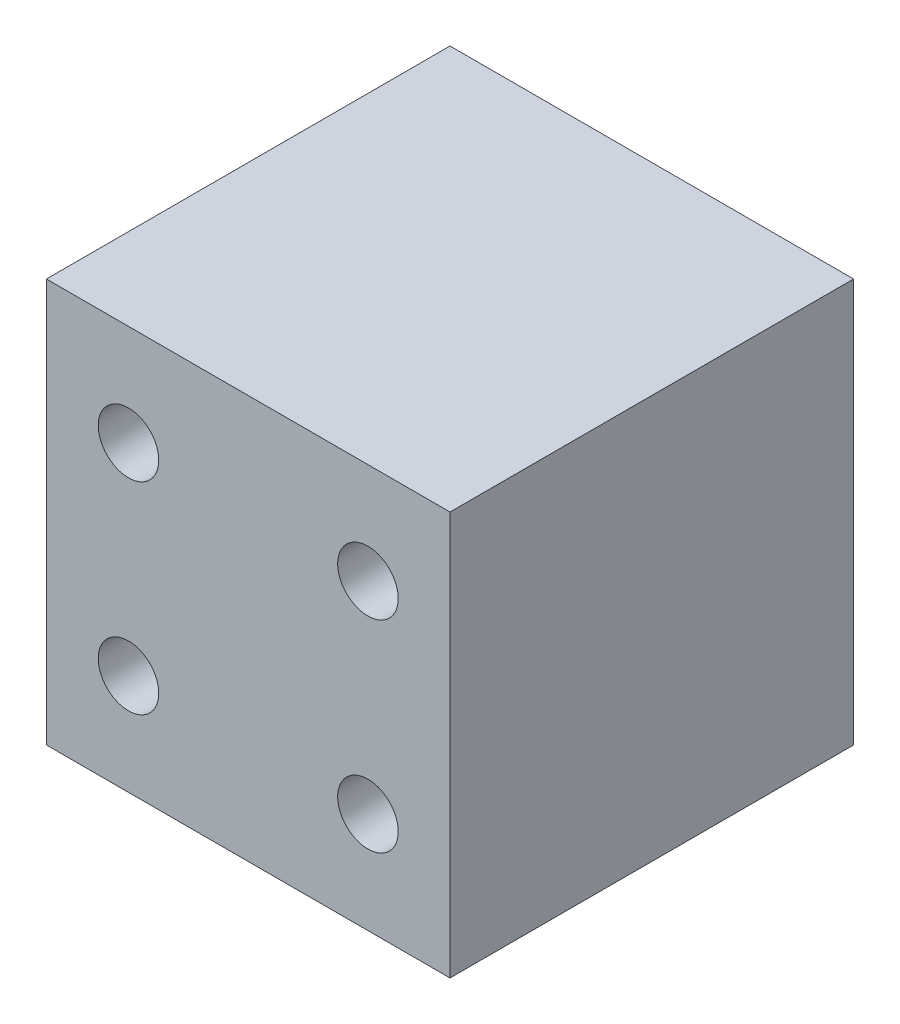
ISO-10303-21;
HEADER;
FILE_DESCRIPTION(('STEP AP214'),'2;1');
FILE_NAME('part.step','',(''),(''),'','','');
FILE_SCHEMA(('AUTOMOTIVE_DESIGN { 1 0 10303 214 1 1 1 1 }'));
ENDSEC;
DATA;
#1=APPLICATION_CONTEXT('core data for automotive mechanical design processes');
#2=APPLICATION_PROTOCOL_DEFINITION('international standard','automotive_design',2000,#1);
#3=PRODUCT_CONTEXT('',#1,'mechanical');
#4=PRODUCT('Part','Part','',(#3));
#5=PRODUCT_RELATED_PRODUCT_CATEGORY('part','',(#4));
#6=PRODUCT_DEFINITION_FORMATION('','',#4);
#7=PRODUCT_DEFINITION_CONTEXT('part definition',#1,'design');
#8=PRODUCT_DEFINITION('design','',#6,#7);
#9=PRODUCT_DEFINITION_SHAPE('','',#8);
#10=(LENGTH_UNIT() NAMED_UNIT(*) SI_UNIT(.MILLI.,.METRE.));
#11=(NAMED_UNIT(*) PLANE_ANGLE_UNIT() SI_UNIT($,.RADIAN.));
#12=(NAMED_UNIT(*) SI_UNIT($,.STERADIAN.) SOLID_ANGLE_UNIT());
#13=UNCERTAINTY_MEASURE_WITH_UNIT(LENGTH_MEASURE(1.E-05),#10,'distance_accuracy_value','');
#14=(GEOMETRIC_REPRESENTATION_CONTEXT(3) GLOBAL_UNCERTAINTY_ASSIGNED_CONTEXT((#13)) GLOBAL_UNIT_ASSIGNED_CONTEXT((#10,
#11,#12)) REPRESENTATION_CONTEXT('',''));
#15=CARTESIAN_POINT('',(0.,0.,0.));
#16=DIRECTION('',(0.,0.,1.));
#17=DIRECTION('',(1.,0.,0.));
#18=AXIS2_PLACEMENT_3D('',#15,#16,#17);
#19=CARTESIAN_POINT('',(15.,15.,30.));
#20=DIRECTION('',(-1.,0.,0.));
#21=DIRECTION('',(0.,0.,1.));
#22=AXIS2_PLACEMENT_3D('',#19,#20,#21);
#23=PLANE('',#22);
#24=DIRECTION('',(0.,1.,0.));
#25=VECTOR('',#24,1.);
#26=CARTESIAN_POINT('',(15.,15.,0.));
#27=LINE('',#26,#25);
#28=CARTESIAN_POINT('',(15.,-15.,0.));
#29=VERTEX_POINT('',#28);
#30=CARTESIAN_POINT('',(15.,15.,0.));
#31=VERTEX_POINT('',#30);
#32=EDGE_CURVE('E106',#29,#31,#27,.T.);
#33=ORIENTED_EDGE('',*,*,#32,.T.);
#34=DIRECTION('',(0.,0.,-1.));
#35=VECTOR('',#34,1.);
#36=CARTESIAN_POINT('',(15.,15.,30.));
#37=LINE('',#36,#35);
#38=CARTESIAN_POINT('',(15.,15.,30.));
#39=VERTEX_POINT('',#38);
#40=EDGE_CURVE('E11',#39,#31,#37,.T.);
#41=ORIENTED_EDGE('',*,*,#40,.F.);
#42=DIRECTION('',(0.,1.,0.));
#43=VECTOR('',#42,1.);
#44=CARTESIAN_POINT('',(15.,15.,30.));
#45=LINE('',#44,#43);
#46=CARTESIAN_POINT('',(15.,-15.,30.));
#47=VERTEX_POINT('',#46);
#48=EDGE_CURVE('E90',#47,#39,#45,.T.);
#49=ORIENTED_EDGE('',*,*,#48,.F.);
#50=DIRECTION('',(0.,0.,-1.));
#51=VECTOR('',#50,1.);
#52=CARTESIAN_POINT('',(15.,-15.,30.));
#53=LINE('',#52,#51);
#54=EDGE_CURVE('E102',#47,#29,#53,.T.);
#55=ORIENTED_EDGE('',*,*,#54,.T.);
#56=EDGE_LOOP('',(#33,#41,#49,#55));
#57=FACE_BOUND('',#56,.T.);
#58=ADVANCED_FACE('F38',(#57),#23,.F.);
#59=CARTESIAN_POINT('',(-15.,15.,30.));
#60=DIRECTION('',(0.,-1.,0.));
#61=DIRECTION('',(0.,0.,-1.));
#62=AXIS2_PLACEMENT_3D('',#59,#60,#61);
#63=PLANE('',#62);
#64=DIRECTION('',(-1.,0.,0.));
#65=VECTOR('',#64,1.);
#66=CARTESIAN_POINT('',(-15.,15.,0.));
#67=LINE('',#66,#65);
#68=CARTESIAN_POINT('',(-15.,15.,0.));
#69=VERTEX_POINT('',#68);
#70=EDGE_CURVE('E95',#31,#69,#67,.T.);
#71=ORIENTED_EDGE('',*,*,#70,.T.);
#72=DIRECTION('',(0.,0.,-1.));
#73=VECTOR('',#72,1.);
#74=CARTESIAN_POINT('',(-15.,15.,30.));
#75=LINE('',#74,#73);
#76=CARTESIAN_POINT('',(-15.,15.,30.));
#77=VERTEX_POINT('',#76);
#78=EDGE_CURVE('E47',#77,#69,#75,.T.);
#79=ORIENTED_EDGE('',*,*,#78,.F.);
#80=DIRECTION('',(-1.,0.,0.));
#81=VECTOR('',#80,1.);
#82=CARTESIAN_POINT('',(-15.,15.,30.));
#83=LINE('',#82,#81);
#84=EDGE_CURVE('E85',#39,#77,#83,.T.);
#85=ORIENTED_EDGE('',*,*,#84,.F.);
#86=ORIENTED_EDGE('',*,*,#40,.T.);
#87=EDGE_LOOP('',(#71,#79,#85,#86));
#88=FACE_BOUND('',#87,.T.);
#89=ADVANCED_FACE('F94',(#88),#63,.F.);
#90=CARTESIAN_POINT('',(-15.,15.,30.));
#91=DIRECTION('',(1.,0.,0.));
#92=DIRECTION('',(0.,0.,-1.));
#93=AXIS2_PLACEMENT_3D('',#90,#91,#92);
#94=PLANE('',#93);
#95=DIRECTION('',(0.,-1.,0.));
#96=VECTOR('',#95,1.);
#97=CARTESIAN_POINT('',(-15.,15.,0.));
#98=LINE('',#97,#96);
#99=CARTESIAN_POINT('',(-15.,-15.,0.));
#100=VERTEX_POINT('',#99);
#101=EDGE_CURVE('E72',#69,#100,#98,.T.);
#102=ORIENTED_EDGE('',*,*,#101,.T.);
#103=DIRECTION('',(0.,0.,-1.));
#104=VECTOR('',#103,1.);
#105=CARTESIAN_POINT('',(-15.,-15.,30.));
#106=LINE('',#105,#104);
#107=CARTESIAN_POINT('',(-15.,-15.,30.));
#108=VERTEX_POINT('',#107);
#109=EDGE_CURVE('E97',#108,#100,#106,.T.);
#110=ORIENTED_EDGE('',*,*,#109,.F.);
#111=DIRECTION('',(0.,-1.,0.));
#112=VECTOR('',#111,1.);
#113=CARTESIAN_POINT('',(-15.,15.,30.));
#114=LINE('',#113,#112);
#115=EDGE_CURVE('E88',#77,#108,#114,.T.);
#116=ORIENTED_EDGE('',*,*,#115,.F.);
#117=ORIENTED_EDGE('',*,*,#78,.T.);
#118=EDGE_LOOP('',(#102,#110,#116,#117));
#119=FACE_BOUND('',#118,.T.);
#120=ADVANCED_FACE('F98',(#119),#94,.F.);
#121=CARTESIAN_POINT('',(-15.,-15.,30.));
#122=DIRECTION('',(0.,1.,0.));
#123=DIRECTION('',(0.,0.,1.));
#124=AXIS2_PLACEMENT_3D('',#121,#122,#123);
#125=PLANE('',#124);
#126=DIRECTION('',(1.,0.,0.));
#127=VECTOR('',#126,1.);
#128=CARTESIAN_POINT('',(-15.,-15.,0.));
#129=LINE('',#128,#127);
#130=EDGE_CURVE('E78',#100,#29,#129,.T.);
#131=ORIENTED_EDGE('',*,*,#130,.T.);
#132=ORIENTED_EDGE('',*,*,#54,.F.);
#133=DIRECTION('',(1.,0.,0.));
#134=VECTOR('',#133,1.);
#135=CARTESIAN_POINT('',(-15.,-15.,30.));
#136=LINE('',#135,#134);
#137=EDGE_CURVE('E55',#108,#47,#136,.T.);
#138=ORIENTED_EDGE('',*,*,#137,.F.);
#139=ORIENTED_EDGE('',*,*,#109,.T.);
#140=EDGE_LOOP('',(#131,#132,#138,#139));
#141=FACE_BOUND('',#140,.T.);
#142=ADVANCED_FACE('F120',(#141),#125,.F.);
#143=CARTESIAN_POINT('',(0.,0.,30.));
#144=DIRECTION('',(0.,0.,1.));
#145=DIRECTION('',(1.,0.,0.));
#146=AXIS2_PLACEMENT_3D('',#143,#144,#145);
#147=PLANE('',#146);
#148=CARTESIAN_POINT('',(8.89999999999995,-7.49999999999993,30.));
#149=DIRECTION('',(0.,0.,1.));
#150=DIRECTION('',(1.,0.,0.));
#151=AXIS2_PLACEMENT_3D('',#148,#149,#150);
#152=CIRCLE('',#151,2.25);
#153=CARTESIAN_POINT('',(11.15,-7.49999999999993,30.));
#154=VERTEX_POINT('',#153);
#155=EDGE_CURVE('E144',#154,#154,#152,.T.);
#156=ORIENTED_EDGE('',*,*,#155,.F.);
#157=EDGE_LOOP('',(#156));
#158=FACE_BOUND('',#157,.T.);
#159=CARTESIAN_POINT('',(-8.90000000000006,7.50000000000007,30.));
#160=DIRECTION('',(0.,0.,1.));
#161=DIRECTION('',(1.,0.,0.));
#162=AXIS2_PLACEMENT_3D('',#159,#160,#161);
#163=CIRCLE('',#162,2.25);
#164=CARTESIAN_POINT('',(-6.65000000000006,7.50000000000007,30.));
#165=VERTEX_POINT('',#164);
#166=EDGE_CURVE('E135',#165,#165,#163,.T.);
#167=ORIENTED_EDGE('',*,*,#166,.F.);
#168=EDGE_LOOP('',(#167));
#169=FACE_BOUND('',#168,.T.);
#170=CARTESIAN_POINT('',(-8.90000000000006,-7.49999999999993,30.));
#171=DIRECTION('',(0.,0.,1.));
#172=DIRECTION('',(1.,0.,0.));
#173=AXIS2_PLACEMENT_3D('',#170,#171,#172);
#174=CIRCLE('',#173,2.25);
#175=CARTESIAN_POINT('',(-6.65000000000006,-7.49999999999993,30.));
#176=VERTEX_POINT('',#175);
#177=EDGE_CURVE('E151',#176,#176,#174,.T.);
#178=ORIENTED_EDGE('',*,*,#177,.F.);
#179=EDGE_LOOP('',(#178));
#180=FACE_BOUND('',#179,.T.);
#181=CARTESIAN_POINT('',(8.89999999999995,7.50000000000007,30.));
#182=DIRECTION('',(0.,0.,1.));
#183=DIRECTION('',(1.,0.,0.));
#184=AXIS2_PLACEMENT_3D('',#181,#182,#183);
#185=CIRCLE('',#184,2.25);
#186=CARTESIAN_POINT('',(11.1499999999999,7.50000000000007,30.));
#187=VERTEX_POINT('',#186);
#188=EDGE_CURVE('E127',#187,#187,#185,.T.);
#189=ORIENTED_EDGE('',*,*,#188,.F.);
#190=EDGE_LOOP('',(#189));
#191=FACE_BOUND('',#190,.T.);
#192=ORIENTED_EDGE('',*,*,#48,.T.);
#193=ORIENTED_EDGE('',*,*,#84,.T.);
#194=ORIENTED_EDGE('',*,*,#115,.T.);
#195=ORIENTED_EDGE('',*,*,#137,.T.);
#196=EDGE_LOOP('',(#192,#193,#194,#195));
#197=FACE_BOUND('',#196,.T.);
#198=ADVANCED_FACE('F86',(#158,#169,#180,#191,#197),#147,.T.);
#199=CARTESIAN_POINT('',(0.,0.,0.));
#200=DIRECTION('',(0.,0.,1.));
#201=DIRECTION('',(1.,0.,0.));
#202=AXIS2_PLACEMENT_3D('',#199,#200,#201);
#203=PLANE('',#202);
#204=CARTESIAN_POINT('',(8.89999999999995,-7.49999999999993,0.));
#205=DIRECTION('',(0.,0.,1.));
#206=DIRECTION('',(1.,0.,0.));
#207=AXIS2_PLACEMENT_3D('',#204,#205,#206);
#208=CIRCLE('',#207,2.25);
#209=CARTESIAN_POINT('',(11.15,-7.49999999999993,0.));
#210=VERTEX_POINT('',#209);
#211=EDGE_CURVE('E131',#210,#210,#208,.T.);
#212=ORIENTED_EDGE('',*,*,#211,.T.);
#213=EDGE_LOOP('',(#212));
#214=FACE_BOUND('',#213,.T.);
#215=CARTESIAN_POINT('',(-8.90000000000006,7.50000000000007,0.));
#216=DIRECTION('',(0.,0.,1.));
#217=DIRECTION('',(1.,0.,0.));
#218=AXIS2_PLACEMENT_3D('',#215,#216,#217);
#219=CIRCLE('',#218,2.25);
#220=CARTESIAN_POINT('',(-6.65000000000006,7.50000000000007,0.));
#221=VERTEX_POINT('',#220);
#222=EDGE_CURVE('E139',#221,#221,#219,.T.);
#223=ORIENTED_EDGE('',*,*,#222,.T.);
#224=EDGE_LOOP('',(#223));
#225=FACE_BOUND('',#224,.T.);
#226=CARTESIAN_POINT('',(-8.90000000000006,-7.49999999999993,0.));
#227=DIRECTION('',(0.,0.,1.));
#228=DIRECTION('',(1.,0.,0.));
#229=AXIS2_PLACEMENT_3D('',#226,#227,#228);
#230=CIRCLE('',#229,2.25);
#231=CARTESIAN_POINT('',(-6.65000000000006,-7.49999999999993,0.));
#232=VERTEX_POINT('',#231);
#233=EDGE_CURVE('E140',#232,#232,#230,.T.);
#234=ORIENTED_EDGE('',*,*,#233,.T.);
#235=EDGE_LOOP('',(#234));
#236=FACE_BOUND('',#235,.T.);
#237=CARTESIAN_POINT('',(8.89999999999995,7.50000000000007,0.));
#238=DIRECTION('',(0.,0.,1.));
#239=DIRECTION('',(1.,0.,0.));
#240=AXIS2_PLACEMENT_3D('',#237,#238,#239);
#241=CIRCLE('',#240,2.25);
#242=CARTESIAN_POINT('',(11.1499999999999,7.50000000000007,0.));
#243=VERTEX_POINT('',#242);
#244=EDGE_CURVE('E110',#243,#243,#241,.T.);
#245=ORIENTED_EDGE('',*,*,#244,.T.);
#246=EDGE_LOOP('',(#245));
#247=FACE_BOUND('',#246,.T.);
#248=ORIENTED_EDGE('',*,*,#32,.F.);
#249=ORIENTED_EDGE('',*,*,#130,.F.);
#250=ORIENTED_EDGE('',*,*,#101,.F.);
#251=ORIENTED_EDGE('',*,*,#70,.F.);
#252=EDGE_LOOP('',(#248,#249,#250,#251));
#253=FACE_BOUND('',#252,.T.);
#254=ADVANCED_FACE('F123',(#214,#225,#236,#247,#253),#203,.F.);
#255=CARTESIAN_POINT('',(8.89999999999995,7.50000000000007,0.));
#256=DIRECTION('',(0.,0.,1.));
#257=DIRECTION('',(1.,0.,0.));
#258=AXIS2_PLACEMENT_3D('',#255,#256,#257);
#259=CYLINDRICAL_SURFACE('',#258,2.25);
#260=ORIENTED_EDGE('',*,*,#244,.F.);
#261=EDGE_LOOP('',(#260));
#262=FACE_BOUND('',#261,.T.);
#263=ORIENTED_EDGE('',*,*,#188,.T.);
#264=EDGE_LOOP('',(#263));
#265=FACE_BOUND('',#264,.T.);
#266=ADVANCED_FACE('F165',(#262,#265),#259,.F.);
#267=CARTESIAN_POINT('',(-8.90000000000006,-7.49999999999993,0.));
#268=DIRECTION('',(0.,0.,1.));
#269=DIRECTION('',(1.,0.,0.));
#270=AXIS2_PLACEMENT_3D('',#267,#268,#269);
#271=CYLINDRICAL_SURFACE('',#270,2.25);
#272=ORIENTED_EDGE('',*,*,#233,.F.);
#273=EDGE_LOOP('',(#272));
#274=FACE_BOUND('',#273,.T.);
#275=ORIENTED_EDGE('',*,*,#177,.T.);
#276=EDGE_LOOP('',(#275));
#277=FACE_BOUND('',#276,.T.);
#278=ADVANCED_FACE('F161',(#274,#277),#271,.F.);
#279=CARTESIAN_POINT('',(-8.90000000000006,7.50000000000007,0.));
#280=DIRECTION('',(0.,0.,1.));
#281=DIRECTION('',(1.,0.,0.));
#282=AXIS2_PLACEMENT_3D('',#279,#280,#281);
#283=CYLINDRICAL_SURFACE('',#282,2.25);
#284=ORIENTED_EDGE('',*,*,#222,.F.);
#285=EDGE_LOOP('',(#284));
#286=FACE_BOUND('',#285,.T.);
#287=ORIENTED_EDGE('',*,*,#166,.T.);
#288=EDGE_LOOP('',(#287));
#289=FACE_BOUND('',#288,.T.);
#290=ADVANCED_FACE('F164',(#286,#289),#283,.F.);
#291=CARTESIAN_POINT('',(8.89999999999995,-7.49999999999993,0.));
#292=DIRECTION('',(0.,0.,1.));
#293=DIRECTION('',(1.,0.,0.));
#294=AXIS2_PLACEMENT_3D('',#291,#292,#293);
#295=CYLINDRICAL_SURFACE('',#294,2.25);
#296=ORIENTED_EDGE('',*,*,#211,.F.);
#297=EDGE_LOOP('',(#296));
#298=FACE_BOUND('',#297,.T.);
#299=ORIENTED_EDGE('',*,*,#155,.T.);
#300=EDGE_LOOP('',(#299));
#301=FACE_BOUND('',#300,.T.);
#302=ADVANCED_FACE('F226',(#298,#301),#295,.F.);
#303=CLOSED_SHELL('',(#58,#89,#120,#142,#198,#254,#266,#278,#290,#302));
#304=MANIFOLD_SOLID_BREP('B2',#303);
#305=ADVANCED_BREP_SHAPE_REPRESENTATION('',(#18,#304),#14);
#306=SHAPE_DEFINITION_REPRESENTATION(#9,#305);
ENDSEC;
END-ISO-10303-21;
